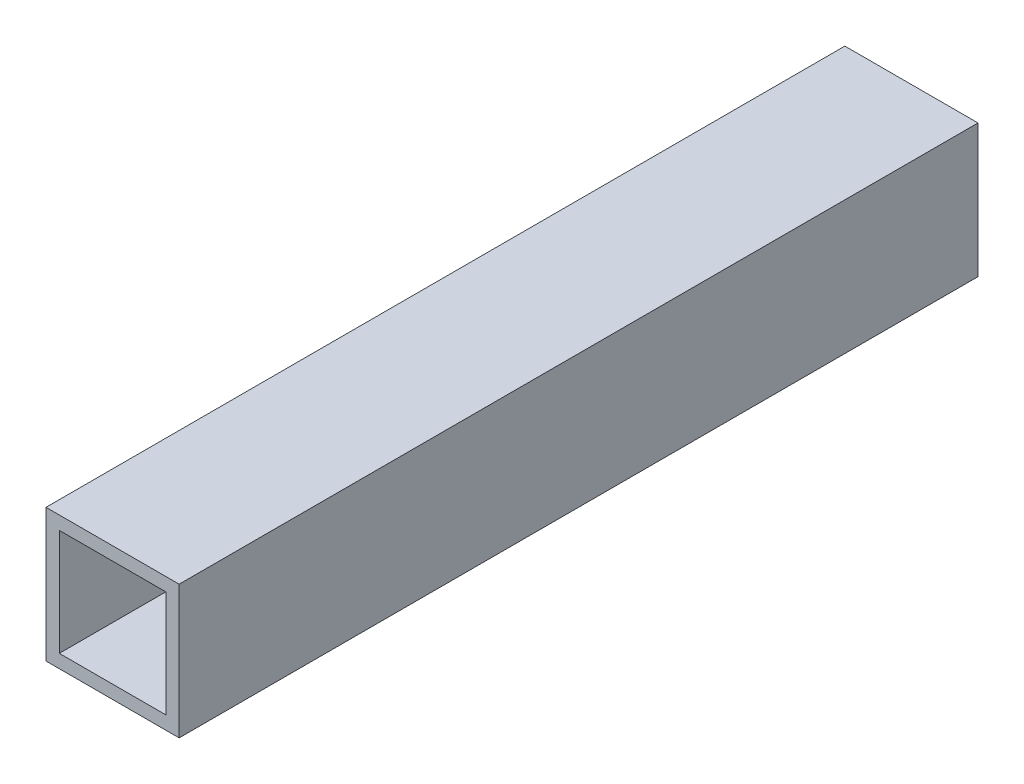
ISO-10303-21;
HEADER;
FILE_DESCRIPTION(('STEP AP214'),'2;1');
FILE_NAME('part.step','',(''),(''),'','','');
FILE_SCHEMA(('AUTOMOTIVE_DESIGN { 1 0 10303 214 1 1 1 1 }'));
ENDSEC;
DATA;
#1=APPLICATION_CONTEXT('core data for automotive mechanical design processes');
#2=APPLICATION_PROTOCOL_DEFINITION('international standard','automotive_design',2000,#1);
#3=PRODUCT_CONTEXT('',#1,'mechanical');
#4=PRODUCT('Part','Part','',(#3));
#5=PRODUCT_RELATED_PRODUCT_CATEGORY('part','',(#4));
#6=PRODUCT_DEFINITION_FORMATION('','',#4);
#7=PRODUCT_DEFINITION_CONTEXT('part definition',#1,'design');
#8=PRODUCT_DEFINITION('design','',#6,#7);
#9=PRODUCT_DEFINITION_SHAPE('','',#8);
#10=(LENGTH_UNIT() NAMED_UNIT(*) SI_UNIT(.MILLI.,.METRE.));
#11=(NAMED_UNIT(*) PLANE_ANGLE_UNIT() SI_UNIT($,.RADIAN.));
#12=(NAMED_UNIT(*) SI_UNIT($,.STERADIAN.) SOLID_ANGLE_UNIT());
#13=UNCERTAINTY_MEASURE_WITH_UNIT(LENGTH_MEASURE(1.E-05),#10,'distance_accuracy_value','');
#14=(GEOMETRIC_REPRESENTATION_CONTEXT(3) GLOBAL_UNCERTAINTY_ASSIGNED_CONTEXT((#13)) GLOBAL_UNIT_ASSIGNED_CONTEXT((#10,
#11,#12)) REPRESENTATION_CONTEXT('',''));
#15=CARTESIAN_POINT('',(0.,0.,0.));
#16=DIRECTION('',(0.,0.,1.));
#17=DIRECTION('',(1.,0.,0.));
#18=AXIS2_PLACEMENT_3D('',#15,#16,#17);
#19=CARTESIAN_POINT('',(7.5,-7.49999999999999,90.));
#20=DIRECTION('',(-1.,0.,0.));
#21=DIRECTION('',(0.,0.,1.));
#22=AXIS2_PLACEMENT_3D('',#19,#20,#21);
#23=PLANE('',#22);
#24=DIRECTION('',(0.,1.,0.));
#25=VECTOR('',#24,1.);
#26=CARTESIAN_POINT('',(7.5,-7.49999999999999,0.));
#27=LINE('',#26,#25);
#28=CARTESIAN_POINT('',(7.5,-7.49999999999999,0.));
#29=VERTEX_POINT('',#28);
#30=CARTESIAN_POINT('',(7.5,7.50000000000001,0.));
#31=VERTEX_POINT('',#30);
#32=EDGE_CURVE('E128',#29,#31,#27,.T.);
#33=ORIENTED_EDGE('',*,*,#32,.T.);
#34=DIRECTION('',(0.,0.,-1.));
#35=VECTOR('',#34,1.);
#36=CARTESIAN_POINT('',(7.5,7.50000000000001,90.));
#37=LINE('',#36,#35);
#38=CARTESIAN_POINT('',(7.5,7.50000000000001,90.));
#39=VERTEX_POINT('',#38);
#40=EDGE_CURVE('E11',#39,#31,#37,.T.);
#41=ORIENTED_EDGE('',*,*,#40,.F.);
#42=DIRECTION('',(0.,1.,0.));
#43=VECTOR('',#42,1.);
#44=CARTESIAN_POINT('',(7.5,-7.49999999999999,90.));
#45=LINE('',#44,#43);
#46=CARTESIAN_POINT('',(7.5,-7.49999999999999,90.));
#47=VERTEX_POINT('',#46);
#48=EDGE_CURVE('E132',#47,#39,#45,.T.);
#49=ORIENTED_EDGE('',*,*,#48,.F.);
#50=DIRECTION('',(0.,0.,-1.));
#51=VECTOR('',#50,1.);
#52=CARTESIAN_POINT('',(7.5,-7.49999999999999,90.));
#53=LINE('',#52,#51);
#54=EDGE_CURVE('E142',#47,#29,#53,.T.);
#55=ORIENTED_EDGE('',*,*,#54,.T.);
#56=EDGE_LOOP('',(#33,#41,#49,#55));
#57=FACE_BOUND('',#56,.T.);
#58=ADVANCED_FACE('F31',(#57),#23,.F.);
#59=CARTESIAN_POINT('',(-7.5,7.50000000000001,90.));
#60=DIRECTION('',(0.,-1.,0.));
#61=DIRECTION('',(0.,0.,-1.));
#62=AXIS2_PLACEMENT_3D('',#59,#60,#61);
#63=PLANE('',#62);
#64=DIRECTION('',(-1.,0.,0.));
#65=VECTOR('',#64,1.);
#66=CARTESIAN_POINT('',(-7.5,7.50000000000001,0.));
#67=LINE('',#66,#65);
#68=CARTESIAN_POINT('',(-7.5,7.50000000000001,0.));
#69=VERTEX_POINT('',#68);
#70=EDGE_CURVE('E145',#31,#69,#67,.T.);
#71=ORIENTED_EDGE('',*,*,#70,.T.);
#72=DIRECTION('',(0.,0.,-1.));
#73=VECTOR('',#72,1.);
#74=CARTESIAN_POINT('',(-7.5,7.50000000000001,90.));
#75=LINE('',#74,#73);
#76=CARTESIAN_POINT('',(-7.5,7.50000000000001,90.));
#77=VERTEX_POINT('',#76);
#78=EDGE_CURVE('E38',#77,#69,#75,.T.);
#79=ORIENTED_EDGE('',*,*,#78,.F.);
#80=DIRECTION('',(-1.,0.,0.));
#81=VECTOR('',#80,1.);
#82=CARTESIAN_POINT('',(-7.5,7.50000000000001,90.));
#83=LINE('',#82,#81);
#84=EDGE_CURVE('E135',#39,#77,#83,.T.);
#85=ORIENTED_EDGE('',*,*,#84,.F.);
#86=ORIENTED_EDGE('',*,*,#40,.T.);
#87=EDGE_LOOP('',(#71,#79,#85,#86));
#88=FACE_BOUND('',#87,.T.);
#89=ADVANCED_FACE('F173',(#88),#63,.F.);
#90=CARTESIAN_POINT('',(-7.5,-7.49999999999999,90.));
#91=DIRECTION('',(1.,0.,0.));
#92=DIRECTION('',(0.,0.,-1.));
#93=AXIS2_PLACEMENT_3D('',#90,#91,#92);
#94=PLANE('',#93);
#95=DIRECTION('',(0.,-1.,0.));
#96=VECTOR('',#95,1.);
#97=CARTESIAN_POINT('',(-7.5,-7.49999999999999,0.));
#98=LINE('',#97,#96);
#99=CARTESIAN_POINT('',(-7.5,-7.49999999999999,0.));
#100=VERTEX_POINT('',#99);
#101=EDGE_CURVE('E147',#69,#100,#98,.T.);
#102=ORIENTED_EDGE('',*,*,#101,.T.);
#103=DIRECTION('',(0.,0.,-1.));
#104=VECTOR('',#103,1.);
#105=CARTESIAN_POINT('',(-7.5,-7.49999999999999,90.));
#106=LINE('',#105,#104);
#107=CARTESIAN_POINT('',(-7.5,-7.49999999999999,90.));
#108=VERTEX_POINT('',#107);
#109=EDGE_CURVE('E152',#108,#100,#106,.T.);
#110=ORIENTED_EDGE('',*,*,#109,.F.);
#111=DIRECTION('',(0.,-1.,0.));
#112=VECTOR('',#111,1.);
#113=CARTESIAN_POINT('',(-7.5,-7.49999999999999,90.));
#114=LINE('',#113,#112);
#115=EDGE_CURVE('E138',#77,#108,#114,.T.);
#116=ORIENTED_EDGE('',*,*,#115,.F.);
#117=ORIENTED_EDGE('',*,*,#78,.T.);
#118=EDGE_LOOP('',(#102,#110,#116,#117));
#119=FACE_BOUND('',#118,.T.);
#120=ADVANCED_FACE('F159',(#119),#94,.F.);
#121=CARTESIAN_POINT('',(-7.5,-7.49999999999999,90.));
#122=DIRECTION('',(0.,1.,0.));
#123=DIRECTION('',(0.,0.,1.));
#124=AXIS2_PLACEMENT_3D('',#121,#122,#123);
#125=PLANE('',#124);
#126=DIRECTION('',(1.,0.,0.));
#127=VECTOR('',#126,1.);
#128=CARTESIAN_POINT('',(-7.5,-7.49999999999999,0.));
#129=LINE('',#128,#127);
#130=EDGE_CURVE('E136',#100,#29,#129,.T.);
#131=ORIENTED_EDGE('',*,*,#130,.T.);
#132=ORIENTED_EDGE('',*,*,#54,.F.);
#133=DIRECTION('',(1.,0.,0.));
#134=VECTOR('',#133,1.);
#135=CARTESIAN_POINT('',(-7.5,-7.49999999999999,90.));
#136=LINE('',#135,#134);
#137=EDGE_CURVE('E140',#108,#47,#136,.T.);
#138=ORIENTED_EDGE('',*,*,#137,.F.);
#139=ORIENTED_EDGE('',*,*,#109,.T.);
#140=EDGE_LOOP('',(#131,#132,#138,#139));
#141=FACE_BOUND('',#140,.T.);
#142=ADVANCED_FACE('F166',(#141),#125,.F.);
#143=CARTESIAN_POINT('',(7.5,7.50000000000001,90.));
#144=DIRECTION('',(0.,0.,-1.));
#145=DIRECTION('',(-1.,0.,0.));
#146=AXIS2_PLACEMENT_3D('',#143,#144,#145);
#147=PLANE('',#146);
#148=DIRECTION('',(-1.,0.,0.));
#149=VECTOR('',#148,1.);
#150=CARTESIAN_POINT('',(-6.,6.00000000000001,90.));
#151=LINE('',#150,#149);
#152=CARTESIAN_POINT('',(6.,6.00000000000001,90.));
#153=VERTEX_POINT('',#152);
#154=CARTESIAN_POINT('',(-6.,6.00000000000001,90.));
#155=VERTEX_POINT('',#154);
#156=EDGE_CURVE('E122',#153,#155,#151,.T.);
#157=ORIENTED_EDGE('',*,*,#156,.F.);
#158=DIRECTION('',(0.,1.,0.));
#159=VECTOR('',#158,1.);
#160=CARTESIAN_POINT('',(6.,-6.00000000000001,90.));
#161=LINE('',#160,#159);
#162=CARTESIAN_POINT('',(6.,-6.00000000000001,90.));
#163=VERTEX_POINT('',#162);
#164=EDGE_CURVE('E45',#163,#153,#161,.T.);
#165=ORIENTED_EDGE('',*,*,#164,.F.);
#166=DIRECTION('',(1.,0.,0.));
#167=VECTOR('',#166,1.);
#168=CARTESIAN_POINT('',(-6.,-6.00000000000001,90.));
#169=LINE('',#168,#167);
#170=CARTESIAN_POINT('',(-6.,-6.00000000000001,90.));
#171=VERTEX_POINT('',#170);
#172=EDGE_CURVE('E113',#171,#163,#169,.T.);
#173=ORIENTED_EDGE('',*,*,#172,.F.);
#174=DIRECTION('',(0.,-1.,0.));
#175=VECTOR('',#174,1.);
#176=CARTESIAN_POINT('',(-6.,-6.00000000000001,90.));
#177=LINE('',#176,#175);
#178=EDGE_CURVE('E116',#155,#171,#177,.T.);
#179=ORIENTED_EDGE('',*,*,#178,.F.);
#180=EDGE_LOOP('',(#157,#165,#173,#179));
#181=FACE_BOUND('',#180,.T.);
#182=ORIENTED_EDGE('',*,*,#48,.T.);
#183=ORIENTED_EDGE('',*,*,#84,.T.);
#184=ORIENTED_EDGE('',*,*,#115,.T.);
#185=ORIENTED_EDGE('',*,*,#137,.T.);
#186=EDGE_LOOP('',(#182,#183,#184,#185));
#187=FACE_BOUND('',#186,.T.);
#188=ADVANCED_FACE('F172',(#181,#187),#147,.F.);
#189=CARTESIAN_POINT('',(7.5,7.50000000000001,0.));
#190=DIRECTION('',(0.,0.,-1.));
#191=DIRECTION('',(-1.,0.,0.));
#192=AXIS2_PLACEMENT_3D('',#189,#190,#191);
#193=PLANE('',#192);
#194=DIRECTION('',(0.,1.,0.));
#195=VECTOR('',#194,1.);
#196=CARTESIAN_POINT('',(6.,-6.00000000000001,0.));
#197=LINE('',#196,#195);
#198=CARTESIAN_POINT('',(6.,-6.00000000000001,0.));
#199=VERTEX_POINT('',#198);
#200=CARTESIAN_POINT('',(6.,6.00000000000001,0.));
#201=VERTEX_POINT('',#200);
#202=EDGE_CURVE('E97',#199,#201,#197,.T.);
#203=ORIENTED_EDGE('',*,*,#202,.T.);
#204=DIRECTION('',(-1.,0.,0.));
#205=VECTOR('',#204,1.);
#206=CARTESIAN_POINT('',(-6.,6.00000000000001,0.));
#207=LINE('',#206,#205);
#208=CARTESIAN_POINT('',(-6.,6.00000000000001,0.));
#209=VERTEX_POINT('',#208);
#210=EDGE_CURVE('E106',#201,#209,#207,.T.);
#211=ORIENTED_EDGE('',*,*,#210,.T.);
#212=DIRECTION('',(0.,-1.,0.));
#213=VECTOR('',#212,1.);
#214=CARTESIAN_POINT('',(-6.,-6.00000000000001,0.));
#215=LINE('',#214,#213);
#216=CARTESIAN_POINT('',(-6.,-6.00000000000001,0.));
#217=VERTEX_POINT('',#216);
#218=EDGE_CURVE('E53',#209,#217,#215,.T.);
#219=ORIENTED_EDGE('',*,*,#218,.T.);
#220=DIRECTION('',(1.,0.,0.));
#221=VECTOR('',#220,1.);
#222=CARTESIAN_POINT('',(-6.,-6.00000000000001,0.));
#223=LINE('',#222,#221);
#224=EDGE_CURVE('E103',#217,#199,#223,.T.);
#225=ORIENTED_EDGE('',*,*,#224,.T.);
#226=EDGE_LOOP('',(#203,#211,#219,#225));
#227=FACE_BOUND('',#226,.T.);
#228=ORIENTED_EDGE('',*,*,#32,.F.);
#229=ORIENTED_EDGE('',*,*,#130,.F.);
#230=ORIENTED_EDGE('',*,*,#101,.F.);
#231=ORIENTED_EDGE('',*,*,#70,.F.);
#232=EDGE_LOOP('',(#228,#229,#230,#231));
#233=FACE_BOUND('',#232,.T.);
#234=ADVANCED_FACE('F110',(#227,#233),#193,.T.);
#235=CARTESIAN_POINT('',(6.,-6.00000000000001,0.));
#236=DIRECTION('',(1.,0.,0.));
#237=DIRECTION('',(0.,0.,-1.));
#238=AXIS2_PLACEMENT_3D('',#235,#236,#237);
#239=PLANE('',#238);
#240=ORIENTED_EDGE('',*,*,#164,.T.);
#241=DIRECTION('',(0.,0.,1.));
#242=VECTOR('',#241,1.);
#243=CARTESIAN_POINT('',(6.,6.00000000000001,0.));
#244=LINE('',#243,#242);
#245=EDGE_CURVE('E93',#201,#153,#244,.T.);
#246=ORIENTED_EDGE('',*,*,#245,.F.);
#247=ORIENTED_EDGE('',*,*,#202,.F.);
#248=DIRECTION('',(0.,0.,1.));
#249=VECTOR('',#248,1.);
#250=CARTESIAN_POINT('',(6.,-6.00000000000001,0.));
#251=LINE('',#250,#249);
#252=EDGE_CURVE('E126',#199,#163,#251,.T.);
#253=ORIENTED_EDGE('',*,*,#252,.T.);
#254=EDGE_LOOP('',(#240,#246,#247,#253));
#255=FACE_BOUND('',#254,.T.);
#256=ADVANCED_FACE('F95',(#255),#239,.F.);
#257=CARTESIAN_POINT('',(-6.,-6.00000000000001,0.));
#258=DIRECTION('',(0.,-1.,0.));
#259=DIRECTION('',(0.,0.,-1.));
#260=AXIS2_PLACEMENT_3D('',#257,#258,#259);
#261=PLANE('',#260);
#262=ORIENTED_EDGE('',*,*,#172,.T.);
#263=ORIENTED_EDGE('',*,*,#252,.F.);
#264=ORIENTED_EDGE('',*,*,#224,.F.);
#265=DIRECTION('',(0.,0.,1.));
#266=VECTOR('',#265,1.);
#267=CARTESIAN_POINT('',(-6.,-6.00000000000001,0.));
#268=LINE('',#267,#266);
#269=EDGE_CURVE('E129',#217,#171,#268,.T.);
#270=ORIENTED_EDGE('',*,*,#269,.T.);
#271=EDGE_LOOP('',(#262,#263,#264,#270));
#272=FACE_BOUND('',#271,.T.);
#273=ADVANCED_FACE('F190',(#272),#261,.F.);
#274=CARTESIAN_POINT('',(-6.,-6.00000000000001,0.));
#275=DIRECTION('',(-1.,0.,0.));
#276=DIRECTION('',(0.,0.,1.));
#277=AXIS2_PLACEMENT_3D('',#274,#275,#276);
#278=PLANE('',#277);
#279=ORIENTED_EDGE('',*,*,#178,.T.);
#280=ORIENTED_EDGE('',*,*,#269,.F.);
#281=ORIENTED_EDGE('',*,*,#218,.F.);
#282=DIRECTION('',(0.,0.,1.));
#283=VECTOR('',#282,1.);
#284=CARTESIAN_POINT('',(-6.,6.00000000000001,0.));
#285=LINE('',#284,#283);
#286=EDGE_CURVE('E102',#209,#155,#285,.T.);
#287=ORIENTED_EDGE('',*,*,#286,.T.);
#288=EDGE_LOOP('',(#279,#280,#281,#287));
#289=FACE_BOUND('',#288,.T.);
#290=ADVANCED_FACE('F193',(#289),#278,.F.);
#291=CARTESIAN_POINT('',(-6.,6.00000000000001,0.));
#292=DIRECTION('',(0.,1.,0.));
#293=DIRECTION('',(0.,0.,1.));
#294=AXIS2_PLACEMENT_3D('',#291,#292,#293);
#295=PLANE('',#294);
#296=ORIENTED_EDGE('',*,*,#156,.T.);
#297=ORIENTED_EDGE('',*,*,#286,.F.);
#298=ORIENTED_EDGE('',*,*,#210,.F.);
#299=ORIENTED_EDGE('',*,*,#245,.T.);
#300=EDGE_LOOP('',(#296,#297,#298,#299));
#301=FACE_BOUND('',#300,.T.);
#302=ADVANCED_FACE('F107',(#301),#295,.F.);
#303=CLOSED_SHELL('',(#58,#89,#120,#142,#188,#234,#256,#273,#290,#302));
#304=MANIFOLD_SOLID_BREP('B2',#303);
#305=ADVANCED_BREP_SHAPE_REPRESENTATION('',(#18,#304),#14);
#306=SHAPE_DEFINITION_REPRESENTATION(#9,#305);
ENDSEC;
END-ISO-10303-21;
